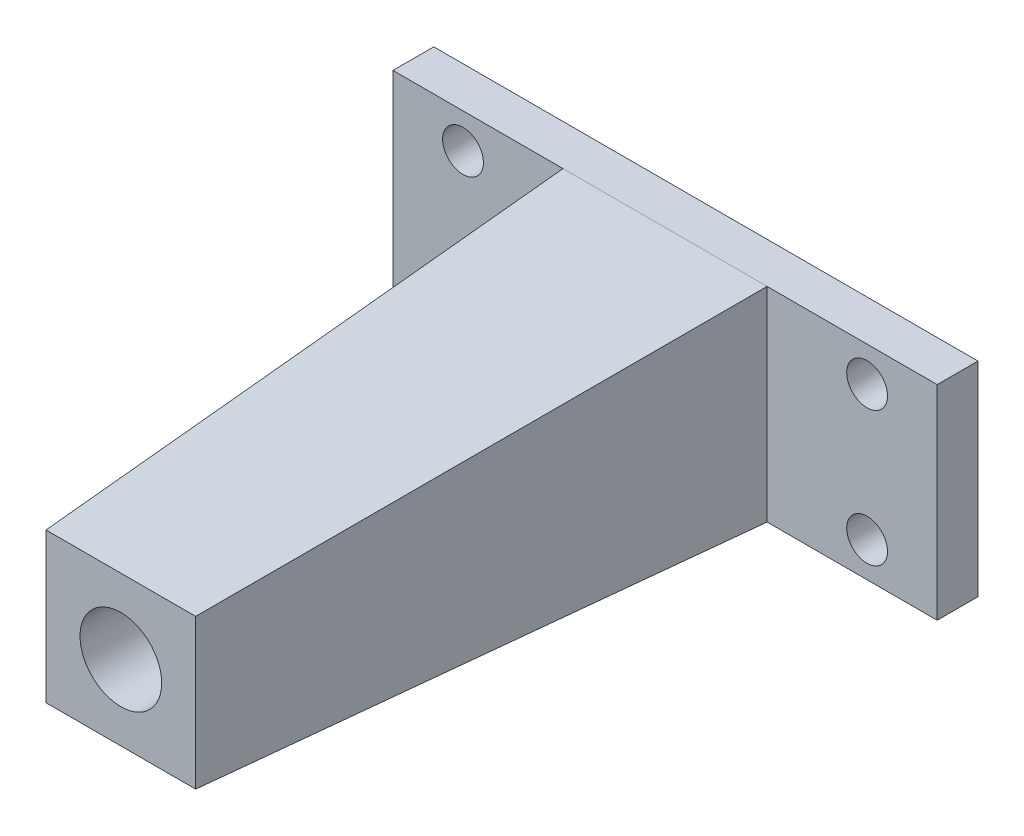
ISO-10303-21;
HEADER;
FILE_DESCRIPTION(('STEP AP214'),'2;1');
FILE_NAME('part.step','',(''),(''),'','','');
FILE_SCHEMA(('AUTOMOTIVE_DESIGN { 1 0 10303 214 1 1 1 1 }'));
ENDSEC;
DATA;
#1=APPLICATION_CONTEXT('core data for automotive mechanical design processes');
#2=APPLICATION_PROTOCOL_DEFINITION('international standard','automotive_design',2000,#1);
#3=PRODUCT_CONTEXT('',#1,'mechanical');
#4=PRODUCT('Part','Part','',(#3));
#5=PRODUCT_RELATED_PRODUCT_CATEGORY('part','',(#4));
#6=PRODUCT_DEFINITION_FORMATION('','',#4);
#7=PRODUCT_DEFINITION_CONTEXT('part definition',#1,'design');
#8=PRODUCT_DEFINITION('design','',#6,#7);
#9=PRODUCT_DEFINITION_SHAPE('','',#8);
#10=(LENGTH_UNIT() NAMED_UNIT(*) SI_UNIT(.MILLI.,.METRE.));
#11=(NAMED_UNIT(*) PLANE_ANGLE_UNIT() SI_UNIT($,.RADIAN.));
#12=(NAMED_UNIT(*) SI_UNIT($,.STERADIAN.) SOLID_ANGLE_UNIT());
#13=UNCERTAINTY_MEASURE_WITH_UNIT(LENGTH_MEASURE(1.E-05),#10,'distance_accuracy_value','');
#14=(GEOMETRIC_REPRESENTATION_CONTEXT(3) GLOBAL_UNCERTAINTY_ASSIGNED_CONTEXT((#13)) GLOBAL_UNIT_ASSIGNED_CONTEXT((#10,
#11,#12)) REPRESENTATION_CONTEXT('',''));
#15=CARTESIAN_POINT('',(0.,0.,0.));
#16=DIRECTION('',(0.,0.,1.));
#17=DIRECTION('',(1.,0.,0.));
#18=AXIS2_PLACEMENT_3D('',#15,#16,#17);
#19=CARTESIAN_POINT('',(0.,0.,3.));
#20=DIRECTION('',(0.,0.,-1.));
#21=DIRECTION('',(-1.,0.,0.));
#22=AXIS2_PLACEMENT_3D('',#19,#20,#21);
#23=PLANE('',#22);
#24=CARTESIAN_POINT('',(14.8489898732236,4.94949493661149,3.));
#25=DIRECTION('',(0.,0.,-1.));
#26=DIRECTION('',(-1.,0.,0.));
#27=AXIS2_PLACEMENT_3D('',#24,#25,#26);
#28=CIRCLE('',#27,1.5);
#29=CARTESIAN_POINT('',(13.3489898732236,4.94949493661149,3.));
#30=VERTEX_POINT('',#29);
#31=EDGE_CURVE('E593',#30,#30,#28,.T.);
#32=ORIENTED_EDGE('',*,*,#31,.T.);
#33=EDGE_LOOP('',(#32));
#34=FACE_BOUND('',#33,.T.);
#35=CARTESIAN_POINT('',(14.8489898732236,-4.95000000000022,3.));
#36=DIRECTION('',(0.,0.,-1.));
#37=DIRECTION('',(-1.,0.,0.));
#38=AXIS2_PLACEMENT_3D('',#35,#36,#37);
#39=CIRCLE('',#38,1.5);
#40=CARTESIAN_POINT('',(13.3489898732236,-4.95000000000022,3.));
#41=VERTEX_POINT('',#40);
#42=EDGE_CURVE('E622',#41,#41,#39,.T.);
#43=ORIENTED_EDGE('',*,*,#42,.T.);
#44=EDGE_LOOP('',(#43));
#45=FACE_BOUND('',#44,.T.);
#46=DIRECTION('',(-1.,0.,0.));
#47=VECTOR('',#46,1.);
#48=CARTESIAN_POINT('',(-20.,7.5,3.));
#49=LINE('',#48,#47);
#50=CARTESIAN_POINT('',(20.,7.5,3.));
#51=VERTEX_POINT('',#50);
#52=CARTESIAN_POINT('',(7.5,7.5,3.));
#53=VERTEX_POINT('',#52);
#54=EDGE_CURVE('E104',#51,#53,#49,.T.);
#55=ORIENTED_EDGE('',*,*,#54,.T.);
#56=DIRECTION('',(0.,1.,0.));
#57=VECTOR('',#56,1.);
#58=CARTESIAN_POINT('',(7.5,-7.5,3.));
#59=LINE('',#58,#57);
#60=CARTESIAN_POINT('',(7.5,-7.5,3.));
#61=VERTEX_POINT('',#60);
#62=EDGE_CURVE('E134',#61,#53,#59,.T.);
#63=ORIENTED_EDGE('',*,*,#62,.F.);
#64=DIRECTION('',(1.,0.,0.));
#65=VECTOR('',#64,1.);
#66=CARTESIAN_POINT('',(-20.,-7.5,3.));
#67=LINE('',#66,#65);
#68=CARTESIAN_POINT('',(20.,-7.5,3.));
#69=VERTEX_POINT('',#68);
#70=EDGE_CURVE('E75',#61,#69,#67,.T.);
#71=ORIENTED_EDGE('',*,*,#70,.T.);
#72=DIRECTION('',(0.,1.,0.));
#73=VECTOR('',#72,1.);
#74=CARTESIAN_POINT('',(20.,-7.5,3.));
#75=LINE('',#74,#73);
#76=EDGE_CURVE('E219',#69,#51,#75,.T.);
#77=ORIENTED_EDGE('',*,*,#76,.T.);
#78=EDGE_LOOP('',(#55,#63,#71,#77));
#79=FACE_BOUND('',#78,.T.);
#80=ADVANCED_FACE('F49',(#34,#45,#79),#23,.F.);
#81=CARTESIAN_POINT('',(-14.8494949366113,-4.9500000000002,3.));
#82=DIRECTION('',(0.,0.,-1.));
#83=DIRECTION('',(-1.,0.,0.));
#84=AXIS2_PLACEMENT_3D('',#81,#82,#83);
#85=CIRCLE('',#84,1.5);
#86=CARTESIAN_POINT('',(-16.3494949366113,-4.9500000000002,3.));
#87=VERTEX_POINT('',#86);
#88=EDGE_CURVE('E585',#87,#87,#85,.T.);
#89=ORIENTED_EDGE('',*,*,#88,.T.);
#90=EDGE_LOOP('',(#89));
#91=FACE_BOUND('',#90,.T.);
#92=CARTESIAN_POINT('',(-14.8494949366113,4.94949493661151,3.));
#93=DIRECTION('',(0.,0.,-1.));
#94=DIRECTION('',(-1.,0.,0.));
#95=AXIS2_PLACEMENT_3D('',#92,#93,#94);
#96=CIRCLE('',#95,1.49999999999999);
#97=CARTESIAN_POINT('',(-16.3494949366113,4.94949493661151,3.));
#98=VERTEX_POINT('',#97);
#99=EDGE_CURVE('E587',#98,#98,#96,.T.);
#100=ORIENTED_EDGE('',*,*,#99,.T.);
#101=EDGE_LOOP('',(#100));
#102=FACE_BOUND('',#101,.T.);
#103=CARTESIAN_POINT('',(-20.,-7.5,3.));
#104=VERTEX_POINT('',#103);
#105=CARTESIAN_POINT('',(-7.5,-7.5,3.));
#106=VERTEX_POINT('',#105);
#107=EDGE_CURVE('E237',#104,#106,#67,.T.);
#108=ORIENTED_EDGE('',*,*,#107,.T.);
#109=DIRECTION('',(0.,-1.,0.));
#110=VECTOR('',#109,1.);
#111=CARTESIAN_POINT('',(-7.5,-7.5,3.));
#112=LINE('',#111,#110);
#113=CARTESIAN_POINT('',(-7.5,7.5,3.));
#114=VERTEX_POINT('',#113);
#115=EDGE_CURVE('E265',#114,#106,#112,.T.);
#116=ORIENTED_EDGE('',*,*,#115,.F.);
#117=CARTESIAN_POINT('',(-20.,7.5,3.));
#118=VERTEX_POINT('',#117);
#119=EDGE_CURVE('E221',#114,#118,#49,.T.);
#120=ORIENTED_EDGE('',*,*,#119,.T.);
#121=DIRECTION('',(0.,-1.,0.));
#122=VECTOR('',#121,1.);
#123=CARTESIAN_POINT('',(-20.,-7.5,3.));
#124=LINE('',#123,#122);
#125=EDGE_CURVE('E224',#118,#104,#124,.T.);
#126=ORIENTED_EDGE('',*,*,#125,.T.);
#127=EDGE_LOOP('',(#108,#116,#120,#126));
#128=FACE_BOUND('',#127,.T.);
#129=ADVANCED_FACE('F254',(#91,#102,#128),#23,.F.);
#130=CARTESIAN_POINT('',(0.,0.,0.));
#131=DIRECTION('',(0.,0.,-1.));
#132=DIRECTION('',(-1.,0.,0.));
#133=AXIS2_PLACEMENT_3D('',#130,#131,#132);
#134=PLANE('',#133);
#135=CARTESIAN_POINT('',(-14.8494949366113,-4.9500000000002,0.));
#136=DIRECTION('',(0.,0.,-1.));
#137=DIRECTION('',(-1.,0.,0.));
#138=AXIS2_PLACEMENT_3D('',#135,#136,#137);
#139=CIRCLE('',#138,1.5);
#140=CARTESIAN_POINT('',(-16.3494949366113,-4.9500000000002,0.));
#141=VERTEX_POINT('',#140);
#142=EDGE_CURVE('E582',#141,#141,#139,.T.);
#143=ORIENTED_EDGE('',*,*,#142,.F.);
#144=EDGE_LOOP('',(#143));
#145=FACE_BOUND('',#144,.T.);
#146=CARTESIAN_POINT('',(-14.8494949366113,4.94949493661151,0.));
#147=DIRECTION('',(0.,0.,-1.));
#148=DIRECTION('',(-1.,0.,0.));
#149=AXIS2_PLACEMENT_3D('',#146,#147,#148);
#150=CIRCLE('',#149,1.49999999999999);
#151=CARTESIAN_POINT('',(-16.3494949366113,4.94949493661151,0.));
#152=VERTEX_POINT('',#151);
#153=EDGE_CURVE('E630',#152,#152,#150,.T.);
#154=ORIENTED_EDGE('',*,*,#153,.F.);
#155=EDGE_LOOP('',(#154));
#156=FACE_BOUND('',#155,.T.);
#157=CARTESIAN_POINT('',(14.8489898732236,4.94949493661149,0.));
#158=DIRECTION('',(0.,0.,-1.));
#159=DIRECTION('',(-1.,0.,0.));
#160=AXIS2_PLACEMENT_3D('',#157,#158,#159);
#161=CIRCLE('',#160,1.5);
#162=CARTESIAN_POINT('',(13.3489898732236,4.94949493661149,0.));
#163=VERTEX_POINT('',#162);
#164=EDGE_CURVE('E628',#163,#163,#161,.T.);
#165=ORIENTED_EDGE('',*,*,#164,.F.);
#166=EDGE_LOOP('',(#165));
#167=FACE_BOUND('',#166,.T.);
#168=CARTESIAN_POINT('',(14.8489898732236,-4.95000000000022,0.));
#169=DIRECTION('',(0.,0.,-1.));
#170=DIRECTION('',(-1.,0.,0.));
#171=AXIS2_PLACEMENT_3D('',#168,#169,#170);
#172=CIRCLE('',#171,1.5);
#173=CARTESIAN_POINT('',(13.3489898732236,-4.95000000000022,0.));
#174=VERTEX_POINT('',#173);
#175=EDGE_CURVE('E625',#174,#174,#172,.T.);
#176=ORIENTED_EDGE('',*,*,#175,.F.);
#177=EDGE_LOOP('',(#176));
#178=FACE_BOUND('',#177,.T.);
#179=CARTESIAN_POINT('',(-4.95,-4.95,0.));
#180=DIRECTION('',(0.,0.,1.));
#181=DIRECTION('',(1.,0.,0.));
#182=AXIS2_PLACEMENT_3D('',#179,#180,#181);
#183=CIRCLE('',#182,1.5);
#184=CARTESIAN_POINT('',(-3.45,-4.95,0.));
#185=VERTEX_POINT('',#184);
#186=EDGE_CURVE('E208',#185,#185,#183,.T.);
#187=ORIENTED_EDGE('',*,*,#186,.T.);
#188=EDGE_LOOP('',(#187));
#189=FACE_BOUND('',#188,.T.);
#190=CARTESIAN_POINT('',(4.95,4.95,0.));
#191=DIRECTION('',(0.,0.,1.));
#192=DIRECTION('',(1.,0.,0.));
#193=AXIS2_PLACEMENT_3D('',#190,#191,#192);
#194=CIRCLE('',#193,1.5);
#195=CARTESIAN_POINT('',(6.45,4.95,0.));
#196=VERTEX_POINT('',#195);
#197=EDGE_CURVE('E215',#196,#196,#194,.T.);
#198=ORIENTED_EDGE('',*,*,#197,.T.);
#199=EDGE_LOOP('',(#198));
#200=FACE_BOUND('',#199,.T.);
#201=DIRECTION('',(0.,1.,0.));
#202=VECTOR('',#201,1.);
#203=CARTESIAN_POINT('',(20.,-7.5,0.));
#204=LINE('',#203,#202);
#205=CARTESIAN_POINT('',(20.,-7.5,0.));
#206=VERTEX_POINT('',#205);
#207=CARTESIAN_POINT('',(20.,7.5,0.));
#208=VERTEX_POINT('',#207);
#209=EDGE_CURVE('E218',#206,#208,#204,.T.);
#210=ORIENTED_EDGE('',*,*,#209,.F.);
#211=DIRECTION('',(1.,0.,0.));
#212=VECTOR('',#211,1.);
#213=CARTESIAN_POINT('',(-20.,-7.5,0.));
#214=LINE('',#213,#212);
#215=CARTESIAN_POINT('',(-20.,-7.5,0.));
#216=VERTEX_POINT('',#215);
#217=EDGE_CURVE('E97',#216,#206,#214,.T.);
#218=ORIENTED_EDGE('',*,*,#217,.F.);
#219=DIRECTION('',(0.,-1.,0.));
#220=VECTOR('',#219,1.);
#221=CARTESIAN_POINT('',(-20.,-7.5,0.));
#222=LINE('',#221,#220);
#223=CARTESIAN_POINT('',(-20.,7.5,0.));
#224=VERTEX_POINT('',#223);
#225=EDGE_CURVE('E239',#224,#216,#222,.T.);
#226=ORIENTED_EDGE('',*,*,#225,.F.);
#227=DIRECTION('',(-1.,0.,0.));
#228=VECTOR('',#227,1.);
#229=CARTESIAN_POINT('',(-20.,7.5,0.));
#230=LINE('',#229,#228);
#231=EDGE_CURVE('E241',#208,#224,#230,.T.);
#232=ORIENTED_EDGE('',*,*,#231,.F.);
#233=EDGE_LOOP('',(#210,#218,#226,#232));
#234=FACE_BOUND('',#233,.T.);
#235=CARTESIAN_POINT('',(4.95,-4.95,0.));
#236=DIRECTION('',(0.,0.,1.));
#237=DIRECTION('',(1.,0.,0.));
#238=AXIS2_PLACEMENT_3D('',#235,#236,#237);
#239=CIRCLE('',#238,1.5);
#240=CARTESIAN_POINT('',(6.45,-4.95,0.));
#241=VERTEX_POINT('',#240);
#242=EDGE_CURVE('E212',#241,#241,#239,.T.);
#243=ORIENTED_EDGE('',*,*,#242,.T.);
#244=EDGE_LOOP('',(#243));
#245=FACE_BOUND('',#244,.T.);
#246=CARTESIAN_POINT('',(-4.95,4.95,0.));
#247=DIRECTION('',(0.,0.,1.));
#248=DIRECTION('',(1.,0.,0.));
#249=AXIS2_PLACEMENT_3D('',#246,#247,#248);
#250=CIRCLE('',#249,1.5);
#251=CARTESIAN_POINT('',(-3.45,4.95,0.));
#252=VERTEX_POINT('',#251);
#253=EDGE_CURVE('E200',#252,#252,#250,.T.);
#254=ORIENTED_EDGE('',*,*,#253,.T.);
#255=EDGE_LOOP('',(#254));
#256=FACE_BOUND('',#255,.T.);
#257=ADVANCED_FACE('F279',(#145,#156,#167,#178,#189,#200,#234,#245,#256),#134,.T.);
#258=CARTESIAN_POINT('',(20.,-7.5,3.));
#259=DIRECTION('',(-1.,0.,0.));
#260=DIRECTION('',(0.,0.,1.));
#261=AXIS2_PLACEMENT_3D('',#258,#259,#260);
#262=PLANE('',#261);
#263=ORIENTED_EDGE('',*,*,#209,.T.);
#264=DIRECTION('',(0.,0.,-1.));
#265=VECTOR('',#264,1.);
#266=CARTESIAN_POINT('',(20.,7.5,3.));
#267=LINE('',#266,#265);
#268=EDGE_CURVE('E12',#51,#208,#267,.T.);
#269=ORIENTED_EDGE('',*,*,#268,.F.);
#270=ORIENTED_EDGE('',*,*,#76,.F.);
#271=DIRECTION('',(0.,0.,-1.));
#272=VECTOR('',#271,1.);
#273=CARTESIAN_POINT('',(20.,-7.5,3.));
#274=LINE('',#273,#272);
#275=EDGE_CURVE('E235',#69,#206,#274,.T.);
#276=ORIENTED_EDGE('',*,*,#275,.T.);
#277=EDGE_LOOP('',(#263,#269,#270,#276));
#278=FACE_BOUND('',#277,.T.);
#279=ADVANCED_FACE('F51',(#278),#262,.F.);
#280=CARTESIAN_POINT('',(-20.,7.5,3.));
#281=DIRECTION('',(0.,-1.,0.));
#282=DIRECTION('',(0.,0.,-1.));
#283=AXIS2_PLACEMENT_3D('',#280,#281,#282);
#284=PLANE('',#283);
#285=ORIENTED_EDGE('',*,*,#231,.T.);
#286=DIRECTION('',(0.,0.,-1.));
#287=VECTOR('',#286,1.);
#288=CARTESIAN_POINT('',(-20.,7.5,3.));
#289=LINE('',#288,#287);
#290=EDGE_CURVE('E58',#118,#224,#289,.T.);
#291=ORIENTED_EDGE('',*,*,#290,.F.);
#292=ORIENTED_EDGE('',*,*,#119,.F.);
#293=DIRECTION('',(-1.,0.,0.));
#294=VECTOR('',#293,1.);
#295=CARTESIAN_POINT('',(-7.5,7.5,3.));
#296=LINE('',#295,#294);
#297=EDGE_CURVE('E267',#53,#114,#296,.T.);
#298=ORIENTED_EDGE('',*,*,#297,.F.);
#299=ORIENTED_EDGE('',*,*,#54,.F.);
#300=ORIENTED_EDGE('',*,*,#268,.T.);
#301=EDGE_LOOP('',(#285,#291,#292,#298,#299,#300));
#302=FACE_BOUND('',#301,.T.);
#303=ADVANCED_FACE('F276',(#302),#284,.F.);
#304=CARTESIAN_POINT('',(-20.,-7.5,3.));
#305=DIRECTION('',(1.,0.,0.));
#306=DIRECTION('',(0.,0.,-1.));
#307=AXIS2_PLACEMENT_3D('',#304,#305,#306);
#308=PLANE('',#307);
#309=ORIENTED_EDGE('',*,*,#225,.T.);
#310=DIRECTION('',(0.,0.,-1.));
#311=VECTOR('',#310,1.);
#312=CARTESIAN_POINT('',(-20.,-7.5,3.));
#313=LINE('',#312,#311);
#314=EDGE_CURVE('E233',#104,#216,#313,.T.);
#315=ORIENTED_EDGE('',*,*,#314,.F.);
#316=ORIENTED_EDGE('',*,*,#125,.F.);
#317=ORIENTED_EDGE('',*,*,#290,.T.);
#318=EDGE_LOOP('',(#309,#315,#316,#317));
#319=FACE_BOUND('',#318,.T.);
#320=ADVANCED_FACE('F258',(#319),#308,.F.);
#321=CARTESIAN_POINT('',(-20.,-7.5,3.));
#322=DIRECTION('',(0.,1.,0.));
#323=DIRECTION('',(0.,0.,1.));
#324=AXIS2_PLACEMENT_3D('',#321,#322,#323);
#325=PLANE('',#324);
#326=ORIENTED_EDGE('',*,*,#217,.T.);
#327=ORIENTED_EDGE('',*,*,#275,.F.);
#328=ORIENTED_EDGE('',*,*,#70,.F.);
#329=DIRECTION('',(1.,0.,0.));
#330=VECTOR('',#329,1.);
#331=CARTESIAN_POINT('',(-7.5,-7.5,3.));
#332=LINE('',#331,#330);
#333=EDGE_CURVE('E209',#106,#61,#332,.T.);
#334=ORIENTED_EDGE('',*,*,#333,.F.);
#335=ORIENTED_EDGE('',*,*,#107,.F.);
#336=ORIENTED_EDGE('',*,*,#314,.T.);
#337=EDGE_LOOP('',(#326,#327,#328,#334,#335,#336));
#338=FACE_BOUND('',#337,.T.);
#339=ADVANCED_FACE('F261',(#338),#325,.F.);
#340=CARTESIAN_POINT('',(4.95,4.95,3.));
#341=DIRECTION('',(0.,0.,-1.));
#342=DIRECTION('',(-1.,0.,0.));
#343=AXIS2_PLACEMENT_3D('',#340,#341,#342);
#344=CYLINDRICAL_SURFACE('',#343,1.5);
#345=ORIENTED_EDGE('',*,*,#197,.F.);
#346=EDGE_LOOP('',(#345));
#347=FACE_BOUND('',#346,.T.);
#348=CARTESIAN_POINT('',(4.95,4.95,8.));
#349=DIRECTION('',(0.,0.,-1.));
#350=DIRECTION('',(-1.,0.,0.));
#351=AXIS2_PLACEMENT_3D('',#348,#349,#350);
#352=CIRCLE('',#351,1.5);
#353=CARTESIAN_POINT('',(3.45,4.95,8.));
#354=VERTEX_POINT('',#353);
#355=EDGE_CURVE('E604',#354,#354,#352,.T.);
#356=ORIENTED_EDGE('',*,*,#355,.F.);
#357=EDGE_LOOP('',(#356));
#358=FACE_BOUND('',#357,.T.);
#359=ADVANCED_FACE('F295',(#347,#358),#344,.F.);
#360=CARTESIAN_POINT('',(4.95,-4.95,3.));
#361=DIRECTION('',(0.,0.,-1.));
#362=DIRECTION('',(-1.,0.,0.));
#363=AXIS2_PLACEMENT_3D('',#360,#361,#362);
#364=CYLINDRICAL_SURFACE('',#363,1.5);
#365=ORIENTED_EDGE('',*,*,#242,.F.);
#366=EDGE_LOOP('',(#365));
#367=FACE_BOUND('',#366,.T.);
#368=CARTESIAN_POINT('',(4.95,-4.95,8.));
#369=DIRECTION('',(0.,0.,-1.));
#370=DIRECTION('',(-1.,0.,0.));
#371=AXIS2_PLACEMENT_3D('',#368,#369,#370);
#372=CIRCLE('',#371,1.5);
#373=CARTESIAN_POINT('',(3.45,-4.95,8.));
#374=VERTEX_POINT('',#373);
#375=EDGE_CURVE('E598',#374,#374,#372,.T.);
#376=ORIENTED_EDGE('',*,*,#375,.F.);
#377=EDGE_LOOP('',(#376));
#378=FACE_BOUND('',#377,.T.);
#379=ADVANCED_FACE('F423',(#367,#378),#364,.F.);
#380=CARTESIAN_POINT('',(-4.95,-4.95,3.));
#381=DIRECTION('',(0.,0.,-1.));
#382=DIRECTION('',(-1.,0.,0.));
#383=AXIS2_PLACEMENT_3D('',#380,#381,#382);
#384=CYLINDRICAL_SURFACE('',#383,1.5);
#385=ORIENTED_EDGE('',*,*,#186,.F.);
#386=EDGE_LOOP('',(#385));
#387=FACE_BOUND('',#386,.T.);
#388=CARTESIAN_POINT('',(-4.95,-4.95,8.));
#389=DIRECTION('',(0.,0.,-1.));
#390=DIRECTION('',(-1.,0.,0.));
#391=AXIS2_PLACEMENT_3D('',#388,#389,#390);
#392=CIRCLE('',#391,1.5);
#393=CARTESIAN_POINT('',(-6.45,-4.95,8.));
#394=VERTEX_POINT('',#393);
#395=EDGE_CURVE('E603',#394,#394,#392,.T.);
#396=ORIENTED_EDGE('',*,*,#395,.F.);
#397=EDGE_LOOP('',(#396));
#398=FACE_BOUND('',#397,.T.);
#399=ADVANCED_FACE('F411',(#387,#398),#384,.F.);
#400=CARTESIAN_POINT('',(-4.95,4.95,3.));
#401=DIRECTION('',(0.,0.,-1.));
#402=DIRECTION('',(-1.,0.,0.));
#403=AXIS2_PLACEMENT_3D('',#400,#401,#402);
#404=CYLINDRICAL_SURFACE('',#403,1.5);
#405=ORIENTED_EDGE('',*,*,#253,.F.);
#406=EDGE_LOOP('',(#405));
#407=FACE_BOUND('',#406,.T.);
#408=CARTESIAN_POINT('',(-4.95,4.95,8.));
#409=DIRECTION('',(0.,0.,-1.));
#410=DIRECTION('',(-1.,0.,0.));
#411=AXIS2_PLACEMENT_3D('',#408,#409,#410);
#412=CIRCLE('',#411,1.5);
#413=CARTESIAN_POINT('',(-6.45,4.95,8.));
#414=VERTEX_POINT('',#413);
#415=EDGE_CURVE('E600',#414,#414,#412,.T.);
#416=ORIENTED_EDGE('',*,*,#415,.F.);
#417=EDGE_LOOP('',(#416));
#418=FACE_BOUND('',#417,.T.);
#419=ADVANCED_FACE('F407',(#407,#418),#404,.F.);
#420=CARTESIAN_POINT('',(0.,7.63092269326683,0.381546134663342));
#421=DIRECTION('',(0.,0.998752338877845,0.0499376169438922));
#422=DIRECTION('',(0.,-0.0499376169438922,0.998752338877845));
#423=AXIS2_PLACEMENT_3D('',#420,#421,#422);
#424=PLANE('',#423);
#425=DIRECTION('',(0.0498754668053816,0.0498754668053816,-0.997509336107633));
#426=VECTOR('',#425,1.);
#427=CARTESIAN_POINT('',(5.5,5.5,43.));
#428=LINE('',#427,#426);
#429=CARTESIAN_POINT('',(5.5,5.5,43.));
#430=VERTEX_POINT('',#429);
#431=EDGE_CURVE('E127',#430,#53,#428,.T.);
#432=ORIENTED_EDGE('',*,*,#431,.T.);
#433=ORIENTED_EDGE('',*,*,#297,.T.);
#434=DIRECTION('',(-0.0498754668053816,0.0498754668053816,-0.997509336107633));
#435=VECTOR('',#434,1.);
#436=CARTESIAN_POINT('',(-5.5,5.5,43.));
#437=LINE('',#436,#435);
#438=CARTESIAN_POINT('',(-5.5,5.5,43.));
#439=VERTEX_POINT('',#438);
#440=EDGE_CURVE('E66',#439,#114,#437,.T.);
#441=ORIENTED_EDGE('',*,*,#440,.F.);
#442=DIRECTION('',(-1.,0.,0.));
#443=VECTOR('',#442,1.);
#444=CARTESIAN_POINT('',(5.5,5.5,43.));
#445=LINE('',#444,#443);
#446=EDGE_CURVE('E137',#430,#439,#445,.T.);
#447=ORIENTED_EDGE('',*,*,#446,.F.);
#448=EDGE_LOOP('',(#432,#433,#441,#447));
#449=FACE_BOUND('',#448,.T.);
#450=ADVANCED_FACE('F139',(#449),#424,.T.);
#451=CARTESIAN_POINT('',(-7.63092269326684,0.,0.381546134663342));
#452=DIRECTION('',(-0.998752338877845,0.,0.0499376169438922));
#453=DIRECTION('',(0.0499376169438922,0.,0.998752338877845));
#454=AXIS2_PLACEMENT_3D('',#451,#452,#453);
#455=PLANE('',#454);
#456=ORIENTED_EDGE('',*,*,#440,.T.);
#457=ORIENTED_EDGE('',*,*,#115,.T.);
#458=DIRECTION('',(-0.0498754668053816,-0.0498754668053816,-0.997509336107633));
#459=VECTOR('',#458,1.);
#460=CARTESIAN_POINT('',(-5.5,-5.5,43.));
#461=LINE('',#460,#459);
#462=CARTESIAN_POINT('',(-5.5,-5.5,43.));
#463=VERTEX_POINT('',#462);
#464=EDGE_CURVE('E143',#463,#106,#461,.T.);
#465=ORIENTED_EDGE('',*,*,#464,.F.);
#466=DIRECTION('',(0.,-1.,0.));
#467=VECTOR('',#466,1.);
#468=CARTESIAN_POINT('',(-5.5,5.5,43.));
#469=LINE('',#468,#467);
#470=EDGE_CURVE('E195',#439,#463,#469,.T.);
#471=ORIENTED_EDGE('',*,*,#470,.F.);
#472=EDGE_LOOP('',(#456,#457,#465,#471));
#473=FACE_BOUND('',#472,.T.);
#474=ADVANCED_FACE('F457',(#473),#455,.T.);
#475=CARTESIAN_POINT('',(7.63092269326684,0.,0.381546134663342));
#476=DIRECTION('',(0.998752338877845,0.,0.0499376169438922));
#477=DIRECTION('',(0.0499376169438922,0.,-0.998752338877845));
#478=AXIS2_PLACEMENT_3D('',#475,#476,#477);
#479=PLANE('',#478);
#480=DIRECTION('',(0.0498754668053816,-0.0498754668053816,-0.997509336107633));
#481=VECTOR('',#480,1.);
#482=CARTESIAN_POINT('',(5.5,-5.5,43.));
#483=LINE('',#482,#481);
#484=CARTESIAN_POINT('',(5.5,-5.5,43.));
#485=VERTEX_POINT('',#484);
#486=EDGE_CURVE('E664',#485,#61,#483,.T.);
#487=ORIENTED_EDGE('',*,*,#486,.T.);
#488=ORIENTED_EDGE('',*,*,#62,.T.);
#489=ORIENTED_EDGE('',*,*,#431,.F.);
#490=DIRECTION('',(0.,1.,0.));
#491=VECTOR('',#490,1.);
#492=CARTESIAN_POINT('',(5.5,-5.5,43.));
#493=LINE('',#492,#491);
#494=EDGE_CURVE('E131',#485,#430,#493,.T.);
#495=ORIENTED_EDGE('',*,*,#494,.F.);
#496=EDGE_LOOP('',(#487,#488,#489,#495));
#497=FACE_BOUND('',#496,.T.);
#498=ADVANCED_FACE('F129',(#497),#479,.T.);
#499=CARTESIAN_POINT('',(0.,-7.63092269326684,0.381546134663342));
#500=DIRECTION('',(0.,-0.998752338877845,0.0499376169438922));
#501=DIRECTION('',(0.,-0.0499376169438922,-0.998752338877845));
#502=AXIS2_PLACEMENT_3D('',#499,#500,#501);
#503=PLANE('',#502);
#504=ORIENTED_EDGE('',*,*,#464,.T.);
#505=ORIENTED_EDGE('',*,*,#333,.T.);
#506=ORIENTED_EDGE('',*,*,#486,.F.);
#507=DIRECTION('',(1.,0.,0.));
#508=VECTOR('',#507,1.);
#509=CARTESIAN_POINT('',(-5.5,-5.5,43.));
#510=LINE('',#509,#508);
#511=EDGE_CURVE('E150',#463,#485,#510,.T.);
#512=ORIENTED_EDGE('',*,*,#511,.F.);
#513=EDGE_LOOP('',(#504,#505,#506,#512));
#514=FACE_BOUND('',#513,.T.);
#515=ADVANCED_FACE('F171',(#514),#503,.T.);
#516=CARTESIAN_POINT('',(0.,0.,43.));
#517=DIRECTION('',(0.,0.,1.));
#518=DIRECTION('',(1.,0.,0.));
#519=AXIS2_PLACEMENT_3D('',#516,#517,#518);
#520=PLANE('',#519);
#521=CARTESIAN_POINT('',(0.,0.,43.));
#522=DIRECTION('',(0.,0.,1.));
#523=DIRECTION('',(1.,0.,0.));
#524=AXIS2_PLACEMENT_3D('',#521,#522,#523);
#525=CIRCLE('',#524,2.99964286625281);
#526=CARTESIAN_POINT('',(2.99964286625281,0.,43.));
#527=VERTEX_POINT('',#526);
#528=EDGE_CURVE('E586',#527,#527,#525,.T.);
#529=ORIENTED_EDGE('',*,*,#528,.F.);
#530=EDGE_LOOP('',(#529));
#531=FACE_BOUND('',#530,.T.);
#532=ORIENTED_EDGE('',*,*,#470,.T.);
#533=ORIENTED_EDGE('',*,*,#511,.T.);
#534=ORIENTED_EDGE('',*,*,#494,.T.);
#535=ORIENTED_EDGE('',*,*,#446,.T.);
#536=EDGE_LOOP('',(#532,#533,#534,#535));
#537=FACE_BOUND('',#536,.T.);
#538=ADVANCED_FACE('F149',(#531,#537),#520,.T.);
#539=CARTESIAN_POINT('',(4.95,4.95,8.));
#540=DIRECTION('',(0.,0.,-1.));
#541=DIRECTION('',(-1.,0.,0.));
#542=AXIS2_PLACEMENT_3D('',#539,#540,#541);
#543=PLANE('',#542);
#544=ORIENTED_EDGE('',*,*,#355,.T.);
#545=EDGE_LOOP('',(#544));
#546=FACE_BOUND('',#545,.T.);
#547=ADVANCED_FACE('F170',(#546),#543,.T.);
#548=CARTESIAN_POINT('',(4.95,-4.95,8.));
#549=DIRECTION('',(0.,0.,-1.));
#550=DIRECTION('',(-1.,0.,0.));
#551=AXIS2_PLACEMENT_3D('',#548,#549,#550);
#552=PLANE('',#551);
#553=ORIENTED_EDGE('',*,*,#375,.T.);
#554=EDGE_LOOP('',(#553));
#555=FACE_BOUND('',#554,.T.);
#556=ADVANCED_FACE('F382',(#555),#552,.T.);
#557=CARTESIAN_POINT('',(-4.95,-4.95,8.));
#558=DIRECTION('',(0.,0.,-1.));
#559=DIRECTION('',(-1.,0.,0.));
#560=AXIS2_PLACEMENT_3D('',#557,#558,#559);
#561=PLANE('',#560);
#562=ORIENTED_EDGE('',*,*,#395,.T.);
#563=EDGE_LOOP('',(#562));
#564=FACE_BOUND('',#563,.T.);
#565=ADVANCED_FACE('F173',(#564),#561,.T.);
#566=CARTESIAN_POINT('',(-4.95,4.95,8.));
#567=DIRECTION('',(0.,0.,-1.));
#568=DIRECTION('',(-1.,0.,0.));
#569=AXIS2_PLACEMENT_3D('',#566,#567,#568);
#570=PLANE('',#569);
#571=ORIENTED_EDGE('',*,*,#415,.T.);
#572=EDGE_LOOP('',(#571));
#573=FACE_BOUND('',#572,.T.);
#574=ADVANCED_FACE('F350',(#573),#570,.T.);
#575=CARTESIAN_POINT('',(0.,0.,28.));
#576=DIRECTION('',(0.,0.,1.));
#577=DIRECTION('',(1.,0.,0.));
#578=AXIS2_PLACEMENT_3D('',#575,#576,#577);
#579=CYLINDRICAL_SURFACE('',#578,2.99964286625281);
#580=CARTESIAN_POINT('',(0.,0.,28.));
#581=DIRECTION('',(0.,0.,1.));
#582=DIRECTION('',(1.,0.,0.));
#583=AXIS2_PLACEMENT_3D('',#580,#581,#582);
#584=CIRCLE('',#583,2.99964286625281);
#585=CARTESIAN_POINT('',(2.99964286625281,0.,28.));
#586=VERTEX_POINT('',#585);
#587=EDGE_CURVE('E590',#586,#586,#584,.T.);
#588=ORIENTED_EDGE('',*,*,#587,.F.);
#589=EDGE_LOOP('',(#588));
#590=FACE_BOUND('',#589,.T.);
#591=ORIENTED_EDGE('',*,*,#528,.T.);
#592=EDGE_LOOP('',(#591));
#593=FACE_BOUND('',#592,.T.);
#594=ADVANCED_FACE('F337',(#590,#593),#579,.F.);
#595=CARTESIAN_POINT('',(0.,0.,28.));
#596=DIRECTION('',(0.,0.,1.));
#597=DIRECTION('',(1.,0.,0.));
#598=AXIS2_PLACEMENT_3D('',#595,#596,#597);
#599=PLANE('',#598);
#600=ORIENTED_EDGE('',*,*,#587,.T.);
#601=EDGE_LOOP('',(#600));
#602=FACE_BOUND('',#601,.T.);
#603=ADVANCED_FACE('F331',(#602),#599,.T.);
#604=CARTESIAN_POINT('',(14.8489898732236,-4.95000000000022,15.));
#605=DIRECTION('',(0.,0.,-1.));
#606=DIRECTION('',(-1.,0.,0.));
#607=AXIS2_PLACEMENT_3D('',#604,#605,#606);
#608=CYLINDRICAL_SURFACE('',#607,1.5);
#609=ORIENTED_EDGE('',*,*,#175,.T.);
#610=EDGE_LOOP('',(#609));
#611=FACE_BOUND('',#610,.T.);
#612=ORIENTED_EDGE('',*,*,#42,.F.);
#613=EDGE_LOOP('',(#612));
#614=FACE_BOUND('',#613,.T.);
#615=ADVANCED_FACE('F336',(#611,#614),#608,.F.);
#616=CARTESIAN_POINT('',(14.8489898732236,4.94949493661149,15.));
#617=DIRECTION('',(0.,0.,-1.));
#618=DIRECTION('',(-1.,0.,0.));
#619=AXIS2_PLACEMENT_3D('',#616,#617,#618);
#620=CYLINDRICAL_SURFACE('',#619,1.5);
#621=ORIENTED_EDGE('',*,*,#164,.T.);
#622=EDGE_LOOP('',(#621));
#623=FACE_BOUND('',#622,.T.);
#624=ORIENTED_EDGE('',*,*,#31,.F.);
#625=EDGE_LOOP('',(#624));
#626=FACE_BOUND('',#625,.T.);
#627=ADVANCED_FACE('F538',(#623,#626),#620,.F.);
#628=CARTESIAN_POINT('',(-14.8494949366113,4.94949493661151,15.));
#629=DIRECTION('',(0.,0.,-1.));
#630=DIRECTION('',(-1.,0.,0.));
#631=AXIS2_PLACEMENT_3D('',#628,#629,#630);
#632=CYLINDRICAL_SURFACE('',#631,1.49999999999999);
#633=ORIENTED_EDGE('',*,*,#153,.T.);
#634=EDGE_LOOP('',(#633));
#635=FACE_BOUND('',#634,.T.);
#636=ORIENTED_EDGE('',*,*,#99,.F.);
#637=EDGE_LOOP('',(#636));
#638=FACE_BOUND('',#637,.T.);
#639=ADVANCED_FACE('F547',(#635,#638),#632,.F.);
#640=CARTESIAN_POINT('',(-14.8494949366113,-4.9500000000002,15.));
#641=DIRECTION('',(0.,0.,-1.));
#642=DIRECTION('',(-1.,0.,0.));
#643=AXIS2_PLACEMENT_3D('',#640,#641,#642);
#644=CYLINDRICAL_SURFACE('',#643,1.5);
#645=ORIENTED_EDGE('',*,*,#142,.T.);
#646=EDGE_LOOP('',(#645));
#647=FACE_BOUND('',#646,.T.);
#648=ORIENTED_EDGE('',*,*,#88,.F.);
#649=EDGE_LOOP('',(#648));
#650=FACE_BOUND('',#649,.T.);
#651=ADVANCED_FACE('F557',(#647,#650),#644,.F.);
#652=CLOSED_SHELL('',(#80,#129,#257,#279,#303,#320,#339,#359,#379,#399,#419,#450,#474,#498,#515,
#538,#547,#556,#565,#574,#594,#603,#615,#627,#639,#651));
#653=MANIFOLD_SOLID_BREP('B2',#652);
#654=ADVANCED_BREP_SHAPE_REPRESENTATION('',(#18,#653),#14);
#655=SHAPE_DEFINITION_REPRESENTATION(#9,#654);
ENDSEC;
END-ISO-10303-21;
